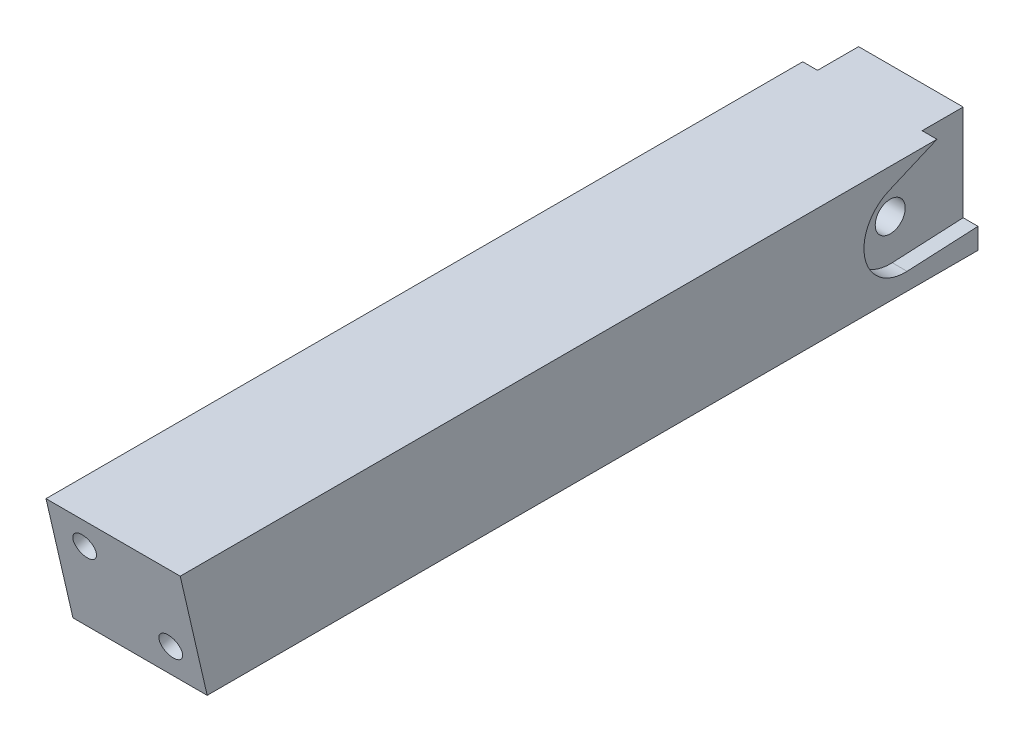
ISO-10303-21;
HEADER;
FILE_DESCRIPTION(('STEP AP214'),'2;1');
FILE_NAME('part.step','',(''),(''),'','','');
FILE_SCHEMA(('AUTOMOTIVE_DESIGN { 1 0 10303 214 1 1 1 1 }'));
ENDSEC;
DATA;
#1=APPLICATION_CONTEXT('core data for automotive mechanical design processes');
#2=APPLICATION_PROTOCOL_DEFINITION('international standard','automotive_design',2000,#1);
#3=PRODUCT_CONTEXT('',#1,'mechanical');
#4=PRODUCT('Part','Part','',(#3));
#5=PRODUCT_RELATED_PRODUCT_CATEGORY('part','',(#4));
#6=PRODUCT_DEFINITION_FORMATION('','',#4);
#7=PRODUCT_DEFINITION_CONTEXT('part definition',#1,'design');
#8=PRODUCT_DEFINITION('design','',#6,#7);
#9=PRODUCT_DEFINITION_SHAPE('','',#8);
#10=(LENGTH_UNIT() NAMED_UNIT(*) SI_UNIT(.MILLI.,.METRE.));
#11=(NAMED_UNIT(*) PLANE_ANGLE_UNIT() SI_UNIT($,.RADIAN.));
#12=(NAMED_UNIT(*) SI_UNIT($,.STERADIAN.) SOLID_ANGLE_UNIT());
#13=UNCERTAINTY_MEASURE_WITH_UNIT(LENGTH_MEASURE(1.E-05),#10,'distance_accuracy_value','');
#14=(GEOMETRIC_REPRESENTATION_CONTEXT(3) GLOBAL_UNCERTAINTY_ASSIGNED_CONTEXT((#13)) GLOBAL_UNIT_ASSIGNED_CONTEXT((#10,
#11,#12)) REPRESENTATION_CONTEXT('',''));
#15=CARTESIAN_POINT('',(0.,0.,0.));
#16=DIRECTION('',(0.,0.,1.));
#17=DIRECTION('',(1.,0.,0.));
#18=AXIS2_PLACEMENT_3D('',#15,#16,#17);
#19=CARTESIAN_POINT('',(14.605,12.7,193.998401745355));
#20=DIRECTION('',(0.,1.,0.));
#21=DIRECTION('',(-1.,0.,0.));
#22=AXIS2_PLACEMENT_3D('',#19,#20,#21);
#23=PLANE('',#22);
#24=DIRECTION('',(0.,0.,-1.));
#25=VECTOR('',#24,1.);
#26=CARTESIAN_POINT('',(11.3792,12.7,193.998401745355));
#27=LINE('',#26,#25);
#28=CARTESIAN_POINT('',(11.3792,12.7,-6.94478213970462));
#29=VERTEX_POINT('',#28);
#30=CARTESIAN_POINT('',(11.3792,12.7,-15.875));
#31=VERTEX_POINT('',#30);
#32=EDGE_CURVE('E151',#29,#31,#27,.T.);
#33=ORIENTED_EDGE('',*,*,#32,.T.);
#34=DIRECTION('',(-1.,0.,0.));
#35=VECTOR('',#34,1.);
#36=CARTESIAN_POINT('',(14.605,12.7,-15.875));
#37=LINE('',#36,#35);
#38=CARTESIAN_POINT('',(-11.3792,12.7,-15.875));
#39=VERTEX_POINT('',#38);
#40=EDGE_CURVE('E201',#31,#39,#37,.T.);
#41=ORIENTED_EDGE('',*,*,#40,.T.);
#42=DIRECTION('',(0.,0.,-1.));
#43=VECTOR('',#42,1.);
#44=CARTESIAN_POINT('',(-11.3792,12.7,193.998401745355));
#45=LINE('',#44,#43);
#46=CARTESIAN_POINT('',(-11.3792,12.7,-6.94478213970461));
#47=VERTEX_POINT('',#46);
#48=EDGE_CURVE('E167',#47,#39,#45,.T.);
#49=ORIENTED_EDGE('',*,*,#48,.F.);
#50=DIRECTION('',(1.,0.,0.));
#51=VECTOR('',#50,1.);
#52=CARTESIAN_POINT('',(14.6049999999999,12.7,-6.94478213970462));
#53=LINE('',#52,#51);
#54=CARTESIAN_POINT('',(-14.605,12.7,-6.94478213970462));
#55=VERTEX_POINT('',#54);
#56=EDGE_CURVE('E178',#55,#47,#53,.T.);
#57=ORIENTED_EDGE('',*,*,#56,.F.);
#58=DIRECTION('',(0.,0.,-1.));
#59=VECTOR('',#58,1.);
#60=CARTESIAN_POINT('',(-14.605,12.7,193.998401745355));
#61=LINE('',#60,#59);
#62=CARTESIAN_POINT('',(-14.605,12.7,157.712358695347));
#63=VERTEX_POINT('',#62);
#64=EDGE_CURVE('E212',#63,#55,#61,.T.);
#65=ORIENTED_EDGE('',*,*,#64,.F.);
#66=DIRECTION('',(-1.,0.,0.));
#67=VECTOR('',#66,1.);
#68=CARTESIAN_POINT('',(14.605,12.7,157.712358695347));
#69=LINE('',#68,#67);
#70=CARTESIAN_POINT('',(14.605,12.7,157.712358695347));
#71=VERTEX_POINT('',#70);
#72=EDGE_CURVE('E213',#71,#63,#69,.T.);
#73=ORIENTED_EDGE('',*,*,#72,.F.);
#74=DIRECTION('',(0.,0.,-1.));
#75=VECTOR('',#74,1.);
#76=CARTESIAN_POINT('',(14.605,12.7,193.998401745355));
#77=LINE('',#76,#75);
#78=CARTESIAN_POINT('',(14.605,12.7,-6.94478213970467));
#79=VERTEX_POINT('',#78);
#80=EDGE_CURVE('E216',#71,#79,#77,.T.);
#81=ORIENTED_EDGE('',*,*,#80,.T.);
#82=DIRECTION('',(-1.,0.,0.));
#83=VECTOR('',#82,1.);
#84=CARTESIAN_POINT('',(14.6049999999999,12.7,-6.94478213970462));
#85=LINE('',#84,#83);
#86=EDGE_CURVE('E160',#79,#29,#85,.T.);
#87=ORIENTED_EDGE('',*,*,#86,.T.);
#88=EDGE_LOOP('',(#33,#41,#49,#57,#65,#73,#81,#87));
#89=FACE_BOUND('',#88,.T.);
#90=ADVANCED_FACE('F41',(#89),#23,.T.);
#91=CARTESIAN_POINT('',(267.669465585855,1012.34188712072,388.497872948252));
#92=DIRECTION('',(0.,-0.224951054343865,0.974370064785235));
#93=DIRECTION('',(0.,0.974370064785235,0.224951054343865));
#94=AXIS2_PLACEMENT_3D('',#91,#92,#93);
#95=PLANE('',#94);
#96=CARTESIAN_POINT('',(-7.62000000000001,6.51275008861376,156.283919500264));
#97=DIRECTION('',(0.,0.224951054343865,-0.974370064785235));
#98=DIRECTION('',(0.,0.974370064785235,0.224951054343865));
#99=AXIS2_PLACEMENT_3D('',#96,#97,#98);
#100=CIRCLE('',#99,2.52729999999989);
#101=CARTESIAN_POINT('',(-7.62000000000001,8.97527555334538,156.852438299907));
#102=VERTEX_POINT('',#101);
#103=EDGE_CURVE('E186',#102,#102,#100,.T.);
#104=ORIENTED_EDGE('',*,*,#103,.T.);
#105=EDGE_LOOP('',(#104));
#106=FACE_BOUND('',#105,.T.);
#107=CARTESIAN_POINT('',(8.25499999999999,-5.86174973415873,153.427041110097));
#108=DIRECTION('',(0.,0.224951054343865,-0.974370064785235));
#109=DIRECTION('',(0.,0.974370064785235,0.224951054343865));
#110=AXIS2_PLACEMENT_3D('',#107,#108,#109);
#111=CIRCLE('',#110,2.52729999999989);
#112=CARTESIAN_POINT('',(8.25499999999999,-3.39922426942711,153.99555990974));
#113=VERTEX_POINT('',#112);
#114=EDGE_CURVE('E189',#113,#113,#111,.T.);
#115=ORIENTED_EDGE('',*,*,#114,.T.);
#116=EDGE_LOOP('',(#115));
#117=FACE_BOUND('',#116,.T.);
#118=DIRECTION('',(0.,-0.974370064785235,-0.224951054343865));
#119=VECTOR('',#118,1.);
#120=CARTESIAN_POINT('',(-14.605,20.653377152135,159.5485404918));
#121=LINE('',#120,#119);
#122=CARTESIAN_POINT('',(-14.605,-12.7,151.848306640758));
#123=VERTEX_POINT('',#122);
#124=EDGE_CURVE('E208',#63,#123,#121,.T.);
#125=ORIENTED_EDGE('',*,*,#124,.T.);
#126=DIRECTION('',(1.,0.,0.));
#127=VECTOR('',#126,1.);
#128=CARTESIAN_POINT('',(14.605,-12.7,151.848306640758));
#129=LINE('',#128,#127);
#130=CARTESIAN_POINT('',(14.605,-12.7,151.848306640758));
#131=VERTEX_POINT('',#130);
#132=EDGE_CURVE('E204',#123,#131,#129,.T.);
#133=ORIENTED_EDGE('',*,*,#132,.T.);
#134=DIRECTION('',(0.,0.974370064785235,0.224951054343865));
#135=VECTOR('',#134,1.);
#136=CARTESIAN_POINT('',(14.605,20.653377152135,159.5485404918));
#137=LINE('',#136,#135);
#138=EDGE_CURVE('E217',#131,#71,#137,.T.);
#139=ORIENTED_EDGE('',*,*,#138,.T.);
#140=ORIENTED_EDGE('',*,*,#72,.T.);
#141=EDGE_LOOP('',(#125,#133,#139,#140));
#142=FACE_BOUND('',#141,.T.);
#143=ADVANCED_FACE('F43',(#106,#117,#142),#95,.T.);
#144=CARTESIAN_POINT('',(14.605,-12.7,193.998401745355));
#145=DIRECTION('',(0.,-1.,0.));
#146=DIRECTION('',(1.,0.,0.));
#147=AXIS2_PLACEMENT_3D('',#144,#145,#146);
#148=PLANE('',#147);
#149=DIRECTION('',(0.,0.,-1.));
#150=VECTOR('',#149,1.);
#151=CARTESIAN_POINT('',(-14.605,-12.7,193.998401745355));
#152=LINE('',#151,#150);
#153=CARTESIAN_POINT('',(-14.605,-12.7,-15.875));
#154=VERTEX_POINT('',#153);
#155=EDGE_CURVE('E211',#123,#154,#152,.T.);
#156=ORIENTED_EDGE('',*,*,#155,.T.);
#157=DIRECTION('',(1.,0.,0.));
#158=VECTOR('',#157,1.);
#159=CARTESIAN_POINT('',(14.605,-12.7,-15.875));
#160=LINE('',#159,#158);
#161=CARTESIAN_POINT('',(14.605,-12.7,-15.875));
#162=VERTEX_POINT('',#161);
#163=EDGE_CURVE('E195',#154,#162,#160,.T.);
#164=ORIENTED_EDGE('',*,*,#163,.T.);
#165=DIRECTION('',(0.,0.,-1.));
#166=VECTOR('',#165,1.);
#167=CARTESIAN_POINT('',(14.605,-12.7,193.998401745355));
#168=LINE('',#167,#166);
#169=EDGE_CURVE('E207',#131,#162,#168,.T.);
#170=ORIENTED_EDGE('',*,*,#169,.F.);
#171=ORIENTED_EDGE('',*,*,#132,.F.);
#172=EDGE_LOOP('',(#156,#164,#170,#171));
#173=FACE_BOUND('',#172,.T.);
#174=ADVANCED_FACE('F260',(#173),#148,.T.);
#175=CARTESIAN_POINT('',(14.605,12.7,193.998401745355));
#176=DIRECTION('',(1.,0.,0.));
#177=DIRECTION('',(0.,1.,0.));
#178=AXIS2_PLACEMENT_3D('',#175,#176,#177);
#179=PLANE('',#178);
#180=DIRECTION('',(0.,0.39364947934886,-0.919260619959526));
#181=VECTOR('',#180,1.);
#182=CARTESIAN_POINT('',(14.605,-60.0145995043923,162.860263534643));
#183=LINE('',#182,#181);
#184=CARTESIAN_POINT('',(14.605,8.21892535093412,3.51954126496229));
#185=VERTEX_POINT('',#184);
#186=EDGE_CURVE('E11',#185,#79,#183,.T.);
#187=ORIENTED_EDGE('',*,*,#186,.T.);
#188=ORIENTED_EDGE('',*,*,#80,.F.);
#189=ORIENTED_EDGE('',*,*,#138,.F.);
#190=ORIENTED_EDGE('',*,*,#169,.T.);
#191=DIRECTION('',(0.,1.,0.));
#192=VECTOR('',#191,1.);
#193=CARTESIAN_POINT('',(14.605,12.7,-15.875));
#194=LINE('',#193,#192);
#195=CARTESIAN_POINT('',(14.605,-8.17014697730187,-15.875));
#196=VERTEX_POINT('',#195);
#197=EDGE_CURVE('E198',#162,#196,#194,.T.);
#198=ORIENTED_EDGE('',*,*,#197,.T.);
#199=DIRECTION('',(0.,0.0491675238021734,-0.998790545911986));
#200=VECTOR('',#199,1.);
#201=CARTESIAN_POINT('',(14.605,-18.4261697094339,192.46615186942));
#202=LINE('',#201,#200);
#203=CARTESIAN_POINT('',(14.605,-8.92998651288988,-0.439596996810471));
#204=VERTEX_POINT('',#203);
#205=EDGE_CURVE('E146',#204,#196,#202,.T.);
#206=ORIENTED_EDGE('',*,*,#205,.F.);
#207=CARTESIAN_POINT('',(14.605,0.,0.));
#208=DIRECTION('',(-1.,0.,0.));
#209=DIRECTION('',(0.,1.,0.));
#210=AXIS2_PLACEMENT_3D('',#207,#208,#209);
#211=CIRCLE('',#210,8.9408);
#212=EDGE_CURVE('E50',#204,#185,#211,.T.);
#213=ORIENTED_EDGE('',*,*,#212,.T.);
#214=EDGE_LOOP('',(#187,#188,#189,#190,#198,#206,#213));
#215=FACE_BOUND('',#214,.T.);
#216=ADVANCED_FACE('F242',(#215),#179,.T.);
#217=CARTESIAN_POINT('',(-14.605,12.7,193.998401745355));
#218=DIRECTION('',(-1.,0.,0.));
#219=DIRECTION('',(0.,-1.,0.));
#220=AXIS2_PLACEMENT_3D('',#217,#218,#219);
#221=PLANE('',#220);
#222=DIRECTION('',(0.,0.0491675238021734,-0.998790545911986));
#223=VECTOR('',#222,1.);
#224=CARTESIAN_POINT('',(-14.605,-18.4261697094339,192.46615186942));
#225=LINE('',#224,#223);
#226=CARTESIAN_POINT('',(-14.605,-8.92998651288988,-0.439596996810471));
#227=VERTEX_POINT('',#226);
#228=CARTESIAN_POINT('',(-14.605,-8.17014697730187,-15.875));
#229=VERTEX_POINT('',#228);
#230=EDGE_CURVE('E175',#227,#229,#225,.T.);
#231=ORIENTED_EDGE('',*,*,#230,.T.);
#232=DIRECTION('',(0.,-1.,0.));
#233=VECTOR('',#232,1.);
#234=CARTESIAN_POINT('',(-14.605,12.7,-15.875));
#235=LINE('',#234,#233);
#236=EDGE_CURVE('E185',#229,#154,#235,.T.);
#237=ORIENTED_EDGE('',*,*,#236,.T.);
#238=ORIENTED_EDGE('',*,*,#155,.F.);
#239=ORIENTED_EDGE('',*,*,#124,.F.);
#240=ORIENTED_EDGE('',*,*,#64,.T.);
#241=DIRECTION('',(0.,0.39364947934886,-0.919260619959526));
#242=VECTOR('',#241,1.);
#243=CARTESIAN_POINT('',(-14.605,-60.0145995043923,162.860263534643));
#244=LINE('',#243,#242);
#245=CARTESIAN_POINT('',(-14.605,8.21892535093413,3.51954126496229));
#246=VERTEX_POINT('',#245);
#247=EDGE_CURVE('E231',#246,#55,#244,.T.);
#248=ORIENTED_EDGE('',*,*,#247,.F.);
#249=CARTESIAN_POINT('',(-14.605,0.,0.));
#250=DIRECTION('',(1.,0.,0.));
#251=DIRECTION('',(0.,-1.,0.));
#252=AXIS2_PLACEMENT_3D('',#249,#250,#251);
#253=CIRCLE('',#252,8.9408);
#254=EDGE_CURVE('E233',#227,#246,#253,.F.);
#255=ORIENTED_EDGE('',*,*,#254,.F.);
#256=EDGE_LOOP('',(#231,#237,#238,#239,#240,#248,#255));
#257=FACE_BOUND('',#256,.T.);
#258=ADVANCED_FACE('F265',(#257),#221,.T.);
#259=CARTESIAN_POINT('',(0.,0.,-15.875));
#260=DIRECTION('',(0.,0.,1.));
#261=DIRECTION('',(-1.,0.,0.));
#262=AXIS2_PLACEMENT_3D('',#259,#260,#261);
#263=PLANE('',#262);
#264=DIRECTION('',(1.,0.,0.));
#265=VECTOR('',#264,1.);
#266=CARTESIAN_POINT('',(0.,-8.17014697730187,-15.875));
#267=LINE('',#266,#265);
#268=CARTESIAN_POINT('',(11.3792,-8.17014697730187,-15.875));
#269=VERTEX_POINT('',#268);
#270=EDGE_CURVE('E236',#269,#196,#267,.T.);
#271=ORIENTED_EDGE('',*,*,#270,.T.);
#272=ORIENTED_EDGE('',*,*,#197,.F.);
#273=ORIENTED_EDGE('',*,*,#163,.F.);
#274=ORIENTED_EDGE('',*,*,#236,.F.);
#275=DIRECTION('',(-1.,0.,0.));
#276=VECTOR('',#275,1.);
#277=CARTESIAN_POINT('',(0.,-8.17014697730187,-15.875));
#278=LINE('',#277,#276);
#279=CARTESIAN_POINT('',(-11.3792,-8.17014697730187,-15.875));
#280=VERTEX_POINT('',#279);
#281=EDGE_CURVE('E229',#280,#229,#278,.T.);
#282=ORIENTED_EDGE('',*,*,#281,.F.);
#283=DIRECTION('',(0.,1.,0.));
#284=VECTOR('',#283,1.);
#285=CARTESIAN_POINT('',(-11.3792,0.,-15.875));
#286=LINE('',#285,#284);
#287=EDGE_CURVE('E227',#280,#39,#286,.T.);
#288=ORIENTED_EDGE('',*,*,#287,.T.);
#289=ORIENTED_EDGE('',*,*,#40,.F.);
#290=DIRECTION('',(0.,1.,0.));
#291=VECTOR('',#290,1.);
#292=CARTESIAN_POINT('',(11.3792,0.,-15.875));
#293=LINE('',#292,#291);
#294=EDGE_CURVE('E238',#269,#31,#293,.T.);
#295=ORIENTED_EDGE('',*,*,#294,.F.);
#296=EDGE_LOOP('',(#271,#272,#273,#274,#282,#288,#289,#295));
#297=FACE_BOUND('',#296,.T.);
#298=ADVANCED_FACE('F248',(#297),#263,.F.);
#299=CARTESIAN_POINT('',(8.25499999999999,-2.29065174644987,137.958916331631));
#300=DIRECTION('',(0.,-0.224951054343865,0.974370064785235));
#301=DIRECTION('',(0.,0.974370064785235,0.224951054343865));
#302=AXIS2_PLACEMENT_3D('',#299,#300,#301);
#303=CYLINDRICAL_SURFACE('',#302,2.52729999999989);
#304=CARTESIAN_POINT('',(8.25499999999999,-2.29065174644987,137.958916331631));
#305=DIRECTION('',(0.,0.224951054343865,-0.974370064785235));
#306=DIRECTION('',(0.,0.974370064785235,0.224951054343865));
#307=AXIS2_PLACEMENT_3D('',#304,#305,#306);
#308=CIRCLE('',#307,2.52729999999989);
#309=CARTESIAN_POINT('',(8.25499999999999,0.17187371828175,138.527435131274));
#310=VERTEX_POINT('',#309);
#311=EDGE_CURVE('E181',#310,#310,#308,.T.);
#312=ORIENTED_EDGE('',*,*,#311,.T.);
#313=EDGE_LOOP('',(#312));
#314=FACE_BOUND('',#313,.T.);
#315=ORIENTED_EDGE('',*,*,#114,.F.);
#316=EDGE_LOOP('',(#315));
#317=FACE_BOUND('',#316,.T.);
#318=ADVANCED_FACE('F319',(#314,#317),#303,.F.);
#319=CARTESIAN_POINT('',(8.25499999999999,-2.29065174644987,137.958916331631));
#320=DIRECTION('',(0.,-0.224951054343865,0.974370064785235));
#321=DIRECTION('',(0.,0.974370064785235,0.224951054343865));
#322=AXIS2_PLACEMENT_3D('',#319,#320,#321);
#323=PLANE('',#322);
#324=ORIENTED_EDGE('',*,*,#311,.F.);
#325=EDGE_LOOP('',(#324));
#326=FACE_BOUND('',#325,.T.);
#327=ADVANCED_FACE('F326',(#326),#323,.T.);
#328=CARTESIAN_POINT('',(-7.62000000000001,10.0838480763226,140.815794721798));
#329=DIRECTION('',(0.,-0.224951054343865,0.974370064785235));
#330=DIRECTION('',(0.,0.974370064785235,0.224951054343865));
#331=AXIS2_PLACEMENT_3D('',#328,#329,#330);
#332=CYLINDRICAL_SURFACE('',#331,2.52729999999989);
#333=CARTESIAN_POINT('',(-7.62000000000001,10.0838480763226,140.815794721798));
#334=DIRECTION('',(0.,0.224951054343865,-0.974370064785235));
#335=DIRECTION('',(0.,0.974370064785235,0.224951054343865));
#336=AXIS2_PLACEMENT_3D('',#333,#334,#335);
#337=CIRCLE('',#336,2.52729999999989);
#338=CARTESIAN_POINT('',(-7.62000000000001,12.5463735410542,141.384313521441));
#339=VERTEX_POINT('',#338);
#340=EDGE_CURVE('E182',#339,#339,#337,.T.);
#341=ORIENTED_EDGE('',*,*,#340,.T.);
#342=EDGE_LOOP('',(#341));
#343=FACE_BOUND('',#342,.T.);
#344=ORIENTED_EDGE('',*,*,#103,.F.);
#345=EDGE_LOOP('',(#344));
#346=FACE_BOUND('',#345,.T.);
#347=ADVANCED_FACE('F335',(#343,#346),#332,.F.);
#348=CARTESIAN_POINT('',(-7.62000000000001,10.0838480763226,140.815794721798));
#349=DIRECTION('',(0.,-0.224951054343865,0.974370064785235));
#350=DIRECTION('',(0.,0.974370064785235,0.224951054343865));
#351=AXIS2_PLACEMENT_3D('',#348,#349,#350);
#352=PLANE('',#351);
#353=ORIENTED_EDGE('',*,*,#340,.F.);
#354=EDGE_LOOP('',(#353));
#355=FACE_BOUND('',#354,.T.);
#356=ADVANCED_FACE('F344',(#355),#352,.T.);
#357=CARTESIAN_POINT('',(-14.605,-8.92998651288988,-0.439596996810471));
#358=DIRECTION('',(0.,-0.998790545911986,-0.0491675238021734));
#359=DIRECTION('',(0.,-0.0491675238021732,0.998790545911986));
#360=AXIS2_PLACEMENT_3D('',#357,#358,#359);
#361=PLANE('',#360);
#362=ORIENTED_EDGE('',*,*,#230,.F.);
#363=DIRECTION('',(1.,0.,0.));
#364=VECTOR('',#363,1.);
#365=CARTESIAN_POINT('',(-14.605,-8.92998651288988,-0.439596996810471));
#366=LINE('',#365,#364);
#367=CARTESIAN_POINT('',(-11.3792,-8.92998651288988,-0.439596996810471));
#368=VERTEX_POINT('',#367);
#369=EDGE_CURVE('E163',#227,#368,#366,.T.);
#370=ORIENTED_EDGE('',*,*,#369,.T.);
#371=DIRECTION('',(0.,0.0491675238021734,-0.998790545911986));
#372=VECTOR('',#371,1.);
#373=CARTESIAN_POINT('',(-11.3792,-8.92998651288988,-0.439596996810471));
#374=LINE('',#373,#372);
#375=EDGE_CURVE('E65',#368,#280,#374,.T.);
#376=ORIENTED_EDGE('',*,*,#375,.T.);
#377=ORIENTED_EDGE('',*,*,#281,.T.);
#378=EDGE_LOOP('',(#362,#370,#376,#377));
#379=FACE_BOUND('',#378,.T.);
#380=ADVANCED_FACE('F267',(#379),#361,.F.);
#381=CARTESIAN_POINT('',(-11.3792,0.,0.));
#382=DIRECTION('',(-1.,0.,0.));
#383=DIRECTION('',(0.,0.974370064785235,0.224951054343865));
#384=AXIS2_PLACEMENT_3D('',#381,#382,#383);
#385=PLANE('',#384);
#386=CARTESIAN_POINT('',(-11.3792,0.,0.));
#387=DIRECTION('',(1.,0.,0.));
#388=DIRECTION('',(0.,0.,-1.));
#389=AXIS2_PLACEMENT_3D('',#386,#387,#388);
#390=CIRCLE('',#389,3.2639);
#391=CARTESIAN_POINT('',(-11.3792,-3.2639,0.));
#392=VERTEX_POINT('',#391);
#393=EDGE_CURVE('E141',#392,#392,#390,.T.);
#394=ORIENTED_EDGE('',*,*,#393,.T.);
#395=EDGE_LOOP('',(#394));
#396=FACE_BOUND('',#395,.T.);
#397=DIRECTION('',(0.,0.39364947934886,-0.919260619959526));
#398=VECTOR('',#397,1.);
#399=CARTESIAN_POINT('',(-11.3792,8.21892535093413,3.51954126496229));
#400=LINE('',#399,#398);
#401=CARTESIAN_POINT('',(-11.3792,8.21892535093413,3.51954126496229));
#402=VERTEX_POINT('',#401);
#403=EDGE_CURVE('E168',#402,#47,#400,.T.);
#404=ORIENTED_EDGE('',*,*,#403,.T.);
#405=ORIENTED_EDGE('',*,*,#48,.T.);
#406=ORIENTED_EDGE('',*,*,#287,.F.);
#407=ORIENTED_EDGE('',*,*,#375,.F.);
#408=CARTESIAN_POINT('',(-11.3792,0.,0.));
#409=DIRECTION('',(1.,0.,0.));
#410=DIRECTION('',(0.,0.,-1.));
#411=AXIS2_PLACEMENT_3D('',#408,#409,#410);
#412=CIRCLE('',#411,8.9408);
#413=EDGE_CURVE('E162',#368,#402,#412,.F.);
#414=ORIENTED_EDGE('',*,*,#413,.T.);
#415=EDGE_LOOP('',(#404,#405,#406,#407,#414));
#416=FACE_BOUND('',#415,.T.);
#417=ADVANCED_FACE('F272',(#396,#416),#385,.T.);
#418=CARTESIAN_POINT('',(-14.605,0.,0.));
#419=DIRECTION('',(1.,0.,0.));
#420=DIRECTION('',(0.,-0.974370064785235,-0.224951054343865));
#421=AXIS2_PLACEMENT_3D('',#418,#419,#420);
#422=CYLINDRICAL_SURFACE('',#421,8.9408);
#423=ORIENTED_EDGE('',*,*,#369,.F.);
#424=ORIENTED_EDGE('',*,*,#254,.T.);
#425=DIRECTION('',(1.,0.,0.));
#426=VECTOR('',#425,1.);
#427=CARTESIAN_POINT('',(-14.605,8.21892535093413,3.51954126496229));
#428=LINE('',#427,#426);
#429=EDGE_CURVE('E165',#246,#402,#428,.T.);
#430=ORIENTED_EDGE('',*,*,#429,.T.);
#431=ORIENTED_EDGE('',*,*,#413,.F.);
#432=EDGE_LOOP('',(#423,#424,#430,#431));
#433=FACE_BOUND('',#432,.T.);
#434=ADVANCED_FACE('F269',(#433),#422,.F.);
#435=CARTESIAN_POINT('',(-14.605,8.21892535093412,3.51954126496229));
#436=DIRECTION('',(0.,-0.919260619959526,-0.39364947934886));
#437=DIRECTION('',(0.,-0.39364947934886,0.919260619959526));
#438=AXIS2_PLACEMENT_3D('',#435,#436,#437);
#439=PLANE('',#438);
#440=ORIENTED_EDGE('',*,*,#247,.T.);
#441=ORIENTED_EDGE('',*,*,#56,.T.);
#442=ORIENTED_EDGE('',*,*,#403,.F.);
#443=ORIENTED_EDGE('',*,*,#429,.F.);
#444=EDGE_LOOP('',(#440,#441,#442,#443));
#445=FACE_BOUND('',#444,.T.);
#446=ADVANCED_FACE('F275',(#445),#439,.T.);
#447=CARTESIAN_POINT('',(11.3792,0.,0.));
#448=DIRECTION('',(-1.,0.,0.));
#449=DIRECTION('',(0.,0.974370064785235,0.224951054343865));
#450=AXIS2_PLACEMENT_3D('',#447,#448,#449);
#451=PLANE('',#450);
#452=CARTESIAN_POINT('',(11.3792,0.,0.));
#453=DIRECTION('',(1.,0.,0.));
#454=DIRECTION('',(0.,0.,-1.));
#455=AXIS2_PLACEMENT_3D('',#452,#453,#454);
#456=CIRCLE('',#455,3.2639);
#457=CARTESIAN_POINT('',(11.3792,-3.2639,0.));
#458=VERTEX_POINT('',#457);
#459=EDGE_CURVE('E45',#458,#458,#456,.T.);
#460=ORIENTED_EDGE('',*,*,#459,.F.);
#461=EDGE_LOOP('',(#460));
#462=FACE_BOUND('',#461,.T.);
#463=ORIENTED_EDGE('',*,*,#32,.F.);
#464=DIRECTION('',(0.,0.39364947934886,-0.919260619959526));
#465=VECTOR('',#464,1.);
#466=CARTESIAN_POINT('',(11.3792,8.21892535093412,3.51954126496229));
#467=LINE('',#466,#465);
#468=CARTESIAN_POINT('',(11.3792,8.21892535093412,3.51954126496229));
#469=VERTEX_POINT('',#468);
#470=EDGE_CURVE('E136',#469,#29,#467,.T.);
#471=ORIENTED_EDGE('',*,*,#470,.F.);
#472=CARTESIAN_POINT('',(11.3792,0.,0.));
#473=DIRECTION('',(1.,0.,0.));
#474=DIRECTION('',(0.,0.,-1.));
#475=AXIS2_PLACEMENT_3D('',#472,#473,#474);
#476=CIRCLE('',#475,8.9408);
#477=CARTESIAN_POINT('',(11.3792,-8.92998651288988,-0.439596996810471));
#478=VERTEX_POINT('',#477);
#479=EDGE_CURVE('E143',#478,#469,#476,.F.);
#480=ORIENTED_EDGE('',*,*,#479,.F.);
#481=DIRECTION('',(0.,0.0491675238021734,-0.998790545911986));
#482=VECTOR('',#481,1.);
#483=CARTESIAN_POINT('',(11.3792,-8.92998651288988,-0.439596996810471));
#484=LINE('',#483,#482);
#485=EDGE_CURVE('E57',#478,#269,#484,.T.);
#486=ORIENTED_EDGE('',*,*,#485,.T.);
#487=ORIENTED_EDGE('',*,*,#294,.T.);
#488=EDGE_LOOP('',(#463,#471,#480,#486,#487));
#489=FACE_BOUND('',#488,.T.);
#490=ADVANCED_FACE('F149',(#462,#489),#451,.F.);
#491=CARTESIAN_POINT('',(14.605,8.21892535093412,3.51954126496229));
#492=DIRECTION('',(0.,0.919260619959526,0.39364947934886));
#493=DIRECTION('',(0.,0.39364947934886,-0.919260619959526));
#494=AXIS2_PLACEMENT_3D('',#491,#492,#493);
#495=PLANE('',#494);
#496=ORIENTED_EDGE('',*,*,#86,.F.);
#497=ORIENTED_EDGE('',*,*,#186,.F.);
#498=DIRECTION('',(1.,0.,0.));
#499=VECTOR('',#498,1.);
#500=CARTESIAN_POINT('',(14.605,8.21892535093412,3.51954126496229));
#501=LINE('',#500,#499);
#502=EDGE_CURVE('E131',#185,#469,#501,.F.);
#503=ORIENTED_EDGE('',*,*,#502,.T.);
#504=ORIENTED_EDGE('',*,*,#470,.T.);
#505=EDGE_LOOP('',(#496,#497,#503,#504));
#506=FACE_BOUND('',#505,.T.);
#507=ADVANCED_FACE('F134',(#506),#495,.F.);
#508=CARTESIAN_POINT('',(14.605,-8.92998651288988,-0.439596996810471));
#509=DIRECTION('',(0.,0.998790545911986,0.0491675238021734));
#510=DIRECTION('',(0.,0.0491675238021732,-0.998790545911986));
#511=AXIS2_PLACEMENT_3D('',#508,#509,#510);
#512=PLANE('',#511);
#513=DIRECTION('',(-1.,0.,0.));
#514=VECTOR('',#513,1.);
#515=CARTESIAN_POINT('',(14.605,-8.92998651288988,-0.439596996810471));
#516=LINE('',#515,#514);
#517=EDGE_CURVE('E145',#204,#478,#516,.T.);
#518=ORIENTED_EDGE('',*,*,#517,.F.);
#519=ORIENTED_EDGE('',*,*,#205,.T.);
#520=ORIENTED_EDGE('',*,*,#270,.F.);
#521=ORIENTED_EDGE('',*,*,#485,.F.);
#522=EDGE_LOOP('',(#518,#519,#520,#521));
#523=FACE_BOUND('',#522,.T.);
#524=ADVANCED_FACE('F246',(#523),#512,.T.);
#525=CARTESIAN_POINT('',(14.605,0.,0.));
#526=DIRECTION('',(-1.,0.,0.));
#527=DIRECTION('',(0.,0.974370064785235,0.224951054343865));
#528=AXIS2_PLACEMENT_3D('',#525,#526,#527);
#529=CYLINDRICAL_SURFACE('',#528,8.9408);
#530=ORIENTED_EDGE('',*,*,#212,.F.);
#531=ORIENTED_EDGE('',*,*,#517,.T.);
#532=ORIENTED_EDGE('',*,*,#479,.T.);
#533=ORIENTED_EDGE('',*,*,#502,.F.);
#534=EDGE_LOOP('',(#530,#531,#532,#533));
#535=FACE_BOUND('',#534,.T.);
#536=ADVANCED_FACE('F144',(#535),#529,.F.);
#537=CARTESIAN_POINT('',(14.605,0.,0.));
#538=DIRECTION('',(-1.,0.,0.));
#539=DIRECTION('',(0.,-1.,0.));
#540=AXIS2_PLACEMENT_3D('',#537,#538,#539);
#541=CYLINDRICAL_SURFACE('',#540,3.2639);
#542=CARTESIAN_POINT('',(-11.3792,-3.2639,0.));
#543=CARTESIAN_POINT('',(-11.1421333333333,-3.2639,0.));
#544=CARTESIAN_POINT('',(-10.9050666666667,-3.2639,0.));
#545=CARTESIAN_POINT('',(-10.4309333333333,-3.2639,0.));
#546=CARTESIAN_POINT('',(-10.1938666666667,-3.2639,0.));
#547=CARTESIAN_POINT('',(-9.71973333333334,-3.2639,0.));
#548=CARTESIAN_POINT('',(-9.48266666666667,-3.2639,0.));
#549=CARTESIAN_POINT('',(-9.00853333333334,-3.2639,0.));
#550=CARTESIAN_POINT('',(-8.77146666666667,-3.2639,0.));
#551=CARTESIAN_POINT('',(-8.29733333333334,-3.2639,0.));
#552=CARTESIAN_POINT('',(-8.06026666666667,-3.2639,0.));
#553=CARTESIAN_POINT('',(-7.58613333333334,-3.2639,0.));
#554=CARTESIAN_POINT('',(-7.34906666666667,-3.2639,0.));
#555=CARTESIAN_POINT('',(-6.87493333333334,-3.2639,0.));
#556=CARTESIAN_POINT('',(-6.63786666666667,-3.2639,0.));
#557=CARTESIAN_POINT('',(-6.16373333333334,-3.2639,0.));
#558=CARTESIAN_POINT('',(-5.92666666666667,-3.2639,0.));
#559=CARTESIAN_POINT('',(-5.45253333333334,-3.2639,0.));
#560=CARTESIAN_POINT('',(-5.21546666666667,-3.2639,0.));
#561=CARTESIAN_POINT('',(-4.74133333333334,-3.2639,0.));
#562=CARTESIAN_POINT('',(-4.50426666666667,-3.2639,0.));
#563=CARTESIAN_POINT('',(-4.03013333333334,-3.2639,0.));
#564=CARTESIAN_POINT('',(-3.79306666666667,-3.2639,0.));
#565=CARTESIAN_POINT('',(-3.31893333333334,-3.2639,0.));
#566=CARTESIAN_POINT('',(-3.08186666666667,-3.2639,0.));
#567=CARTESIAN_POINT('',(-2.60773333333334,-3.2639,0.));
#568=CARTESIAN_POINT('',(-2.37066666666667,-3.2639,0.));
#569=CARTESIAN_POINT('',(-1.89653333333334,-3.2639,0.));
#570=CARTESIAN_POINT('',(-1.65946666666667,-3.2639,0.));
#571=CARTESIAN_POINT('',(-1.18533333333334,-3.2639,0.));
#572=CARTESIAN_POINT('',(-0.94826666666667,-3.2639,0.));
#573=CARTESIAN_POINT('',(-0.474133333333337,-3.2639,0.));
#574=CARTESIAN_POINT('',(-0.23706666666667,-3.2639,0.));
#575=CARTESIAN_POINT('',(0.237066666666663,-3.2639,0.));
#576=CARTESIAN_POINT('',(0.47413333333333,-3.2639,0.));
#577=CARTESIAN_POINT('',(0.948266666666664,-3.2639,0.));
#578=CARTESIAN_POINT('',(1.18533333333333,-3.2639,0.));
#579=CARTESIAN_POINT('',(1.65946666666666,-3.2639,0.));
#580=CARTESIAN_POINT('',(1.89653333333333,-3.2639,0.));
#581=CARTESIAN_POINT('',(2.37066666666666,-3.2639,0.));
#582=CARTESIAN_POINT('',(2.60773333333333,-3.2639,0.));
#583=CARTESIAN_POINT('',(3.08186666666666,-3.2639,0.));
#584=CARTESIAN_POINT('',(3.31893333333333,-3.2639,0.));
#585=CARTESIAN_POINT('',(3.79306666666666,-3.2639,0.));
#586=CARTESIAN_POINT('',(4.03013333333333,-3.2639,0.));
#587=CARTESIAN_POINT('',(4.50426666666667,-3.2639,0.));
#588=CARTESIAN_POINT('',(4.74133333333333,-3.2639,0.));
#589=CARTESIAN_POINT('',(5.21546666666666,-3.2639,0.));
#590=CARTESIAN_POINT('',(5.45253333333333,-3.2639,0.));
#591=CARTESIAN_POINT('',(5.92666666666666,-3.2639,0.));
#592=CARTESIAN_POINT('',(6.16373333333333,-3.2639,0.));
#593=CARTESIAN_POINT('',(6.63786666666666,-3.2639,0.));
#594=CARTESIAN_POINT('',(6.87493333333333,-3.2639,0.));
#595=CARTESIAN_POINT('',(7.34906666666666,-3.2639,0.));
#596=CARTESIAN_POINT('',(7.58613333333333,-3.2639,0.));
#597=CARTESIAN_POINT('',(8.06026666666667,-3.2639,0.));
#598=CARTESIAN_POINT('',(8.29733333333333,-3.2639,0.));
#599=CARTESIAN_POINT('',(8.77146666666667,-3.2639,0.));
#600=CARTESIAN_POINT('',(9.00853333333333,-3.2639,0.));
#601=CARTESIAN_POINT('',(9.48266666666667,-3.2639,0.));
#602=CARTESIAN_POINT('',(9.71973333333333,-3.2639,0.));
#603=CARTESIAN_POINT('',(10.1938666666667,-3.2639,0.));
#604=CARTESIAN_POINT('',(10.4309333333333,-3.2639,0.));
#605=CARTESIAN_POINT('',(10.9050666666667,-3.2639,0.));
#606=CARTESIAN_POINT('',(11.1421333333333,-3.2639,0.));
#607=CARTESIAN_POINT('',(11.3792,-3.2639,0.));
#608=B_SPLINE_CURVE_WITH_KNOTS('',3,(#542,#543,#544,#545,#546,#547,#548,#549,#550,#551,#552,
#553,#554,#555,#556,#557,#558,#559,#560,#561,#562,#563,#564,#565,#566,#567,#568,#569,#570,#571,
#572,#573,#574,#575,#576,#577,#578,#579,#580,#581,#582,#583,#584,#585,#586,#587,#588,#589,#590,
#591,#592,#593,#594,#595,#596,#597,#598,#599,#600,#601,#602,#603,#604,#605,#606,#607),
.UNSPECIFIED.,.F.,.F.,(4,2,2,2,2,2,2,2,2,2,2,2,2,2,2,2,2,2,2,2,2,2,2,2,2,2,2,2,2,2,2,2,4),(0.,
0.711199999999999,1.4224,2.1336,2.8448,3.556,4.2672,4.9784,5.6896,6.4008,7.112,7.8232,8.5344,
9.2456,9.9568,10.668,11.3792,12.0904,12.8016,13.5128,14.224,14.9352,15.6464,16.3576,17.0688,
17.78,18.4912,19.2024,19.9136,20.6248,21.336,22.0472,22.7584),.UNSPECIFIED.);
#609=EDGE_CURVE('BSEAM415',#392,#458,#608,.T.);
#610=ORIENTED_EDGE('',*,*,#393,.F.);
#611=ORIENTED_EDGE('',*,*,#459,.T.);
#612=ORIENTED_EDGE('',*,*,#609,.T.);
#613=ORIENTED_EDGE('',*,*,#609,.F.);
#614=EDGE_LOOP('',(#610,#612,#611,#613));
#615=FACE_BOUND('',#614,.T.);
#616=ADVANCED_FACE('F415',(#615),#541,.F.);
#617=CLOSED_SHELL('',(#90,#143,#174,#216,#258,#298,#318,#327,#347,#356,#380,#417,#434,#446,#490,
#507,#524,#536,#616));
#618=MANIFOLD_SOLID_BREP('B2',#617);
#619=ADVANCED_BREP_SHAPE_REPRESENTATION('',(#18,#618),#14);
#620=SHAPE_DEFINITION_REPRESENTATION(#9,#619);
ENDSEC;
END-ISO-10303-21;
